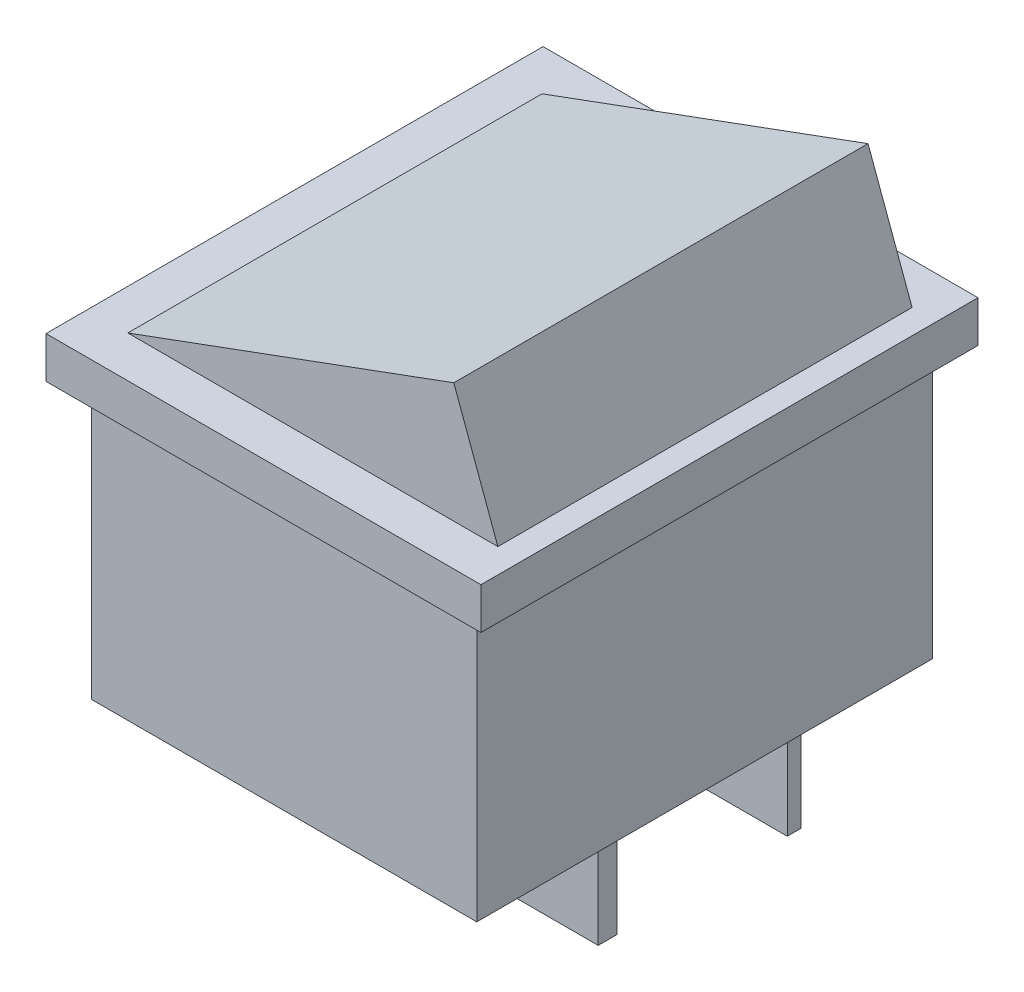
ISO-10303-21;
HEADER;
FILE_DESCRIPTION(('STEP AP214'),'2;1');
FILE_NAME('part.step','',(''),(''),'','','');
FILE_SCHEMA(('AUTOMOTIVE_DESIGN { 1 0 10303 214 1 1 1 1 }'));
ENDSEC;
DATA;
#1=APPLICATION_CONTEXT('core data for automotive mechanical design processes');
#2=APPLICATION_PROTOCOL_DEFINITION('international standard','automotive_design',2000,#1);
#3=PRODUCT_CONTEXT('',#1,'mechanical');
#4=PRODUCT('Part','Part','',(#3));
#5=PRODUCT_RELATED_PRODUCT_CATEGORY('part','',(#4));
#6=PRODUCT_DEFINITION_FORMATION('','',#4);
#7=PRODUCT_DEFINITION_CONTEXT('part definition',#1,'design');
#8=PRODUCT_DEFINITION('design','',#6,#7);
#9=PRODUCT_DEFINITION_SHAPE('','',#8);
#10=(LENGTH_UNIT() NAMED_UNIT(*) SI_UNIT(.MILLI.,.METRE.));
#11=(NAMED_UNIT(*) PLANE_ANGLE_UNIT() SI_UNIT($,.RADIAN.));
#12=(NAMED_UNIT(*) SI_UNIT($,.STERADIAN.) SOLID_ANGLE_UNIT());
#13=UNCERTAINTY_MEASURE_WITH_UNIT(LENGTH_MEASURE(1.E-05),#10,'distance_accuracy_value','');
#14=(GEOMETRIC_REPRESENTATION_CONTEXT(3) GLOBAL_UNCERTAINTY_ASSIGNED_CONTEXT((#13)) GLOBAL_UNIT_ASSIGNED_CONTEXT((#10,
#11,#12)) REPRESENTATION_CONTEXT('',''));
#15=CARTESIAN_POINT('',(0.,0.,0.));
#16=DIRECTION('',(0.,0.,1.));
#17=DIRECTION('',(1.,0.,0.));
#18=AXIS2_PLACEMENT_3D('',#15,#16,#17);
#19=CARTESIAN_POINT('',(0.,-13.2,0.));
#20=DIRECTION('',(0.,1.,0.));
#21=DIRECTION('',(0.,0.,1.));
#22=AXIS2_PLACEMENT_3D('',#19,#20,#21);
#23=PLANE('',#22);
#24=DIRECTION('',(0.,0.,1.));
#25=VECTOR('',#24,1.);
#26=CARTESIAN_POINT('',(-0.986539017006294,-13.2,-6.3761553842312));
#27=LINE('',#26,#25);
#28=CARTESIAN_POINT('',(-0.986539017006294,-13.2,-7.03770330952125));
#29=VERTEX_POINT('',#28);
#30=CARTESIAN_POINT('',(-0.986539017006294,-13.2,-6.3761553842312));
#31=VERTEX_POINT('',#30);
#32=EDGE_CURVE('E265',#29,#31,#27,.T.);
#33=ORIENTED_EDGE('',*,*,#32,.F.);
#34=DIRECTION('',(1.,0.,0.));
#35=VECTOR('',#34,1.);
#36=CARTESIAN_POINT('',(-7.50222735030093,-13.2,-7.03770330952125));
#37=LINE('',#36,#35);
#38=CARTESIAN_POINT('',(-7.50222735030093,-13.2,-7.03770330952125));
#39=VERTEX_POINT('',#38);
#40=EDGE_CURVE('E270',#39,#29,#37,.T.);
#41=ORIENTED_EDGE('',*,*,#40,.F.);
#42=DIRECTION('',(0.,0.,-1.));
#43=VECTOR('',#42,1.);
#44=CARTESIAN_POINT('',(-7.50222735030093,-13.2,-6.3761553842312));
#45=LINE('',#44,#43);
#46=CARTESIAN_POINT('',(-7.50222735030093,-13.2,-6.3761553842312));
#47=VERTEX_POINT('',#46);
#48=EDGE_CURVE('E282',#47,#39,#45,.T.);
#49=ORIENTED_EDGE('',*,*,#48,.F.);
#50=DIRECTION('',(-1.,0.,0.));
#51=VECTOR('',#50,1.);
#52=CARTESIAN_POINT('',(-7.50222735030093,-13.2,-6.3761553842312));
#53=LINE('',#52,#51);
#54=EDGE_CURVE('E279',#31,#47,#53,.T.);
#55=ORIENTED_EDGE('',*,*,#54,.F.);
#56=EDGE_LOOP('',(#33,#41,#49,#55));
#57=FACE_BOUND('',#56,.T.);
#58=DIRECTION('',(0.,0.,-1.));
#59=VECTOR('',#58,1.);
#60=CARTESIAN_POINT('',(2.02938496040161,-13.2,2.75328556763554));
#61=LINE('',#60,#59);
#62=CARTESIAN_POINT('',(2.02938496040161,-13.2,2.75328556763554));
#63=VERTEX_POINT('',#62);
#64=CARTESIAN_POINT('',(2.02938496040161,-13.2,1.85668036748154));
#65=VERTEX_POINT('',#64);
#66=EDGE_CURVE('E331',#63,#65,#61,.T.);
#67=ORIENTED_EDGE('',*,*,#66,.F.);
#68=DIRECTION('',(-1.,0.,0.));
#69=VECTOR('',#68,1.);
#70=CARTESIAN_POINT('',(6.91493386619157,-13.2,2.75328556763554));
#71=LINE('',#70,#69);
#72=CARTESIAN_POINT('',(6.91493386619157,-13.2,2.75328556763554));
#73=VERTEX_POINT('',#72);
#74=EDGE_CURVE('E336',#73,#63,#71,.T.);
#75=ORIENTED_EDGE('',*,*,#74,.F.);
#76=DIRECTION('',(0.,0.,1.));
#77=VECTOR('',#76,1.);
#78=CARTESIAN_POINT('',(6.91493386619157,-13.2,2.75328556763554));
#79=LINE('',#78,#77);
#80=CARTESIAN_POINT('',(6.91493386619157,-13.2,1.85668036748154));
#81=VERTEX_POINT('',#80);
#82=EDGE_CURVE('E348',#81,#73,#79,.T.);
#83=ORIENTED_EDGE('',*,*,#82,.F.);
#84=DIRECTION('',(1.,0.,0.));
#85=VECTOR('',#84,1.);
#86=CARTESIAN_POINT('',(6.91493386619157,-13.2,1.85668036748154));
#87=LINE('',#86,#85);
#88=EDGE_CURVE('E345',#65,#81,#87,.T.);
#89=ORIENTED_EDGE('',*,*,#88,.F.);
#90=EDGE_LOOP('',(#67,#75,#83,#89));
#91=FACE_BOUND('',#90,.T.);
#92=DIRECTION('',(0.,0.,1.));
#93=VECTOR('',#92,1.);
#94=CARTESIAN_POINT('',(9.3,-13.2,-11.));
#95=LINE('',#94,#93);
#96=CARTESIAN_POINT('',(9.3,-13.2,-11.));
#97=VERTEX_POINT('',#96);
#98=CARTESIAN_POINT('',(9.3,-13.2,11.));
#99=VERTEX_POINT('',#98);
#100=EDGE_CURVE('E365',#97,#99,#95,.T.);
#101=ORIENTED_EDGE('',*,*,#100,.T.);
#102=DIRECTION('',(-1.,0.,0.));
#103=VECTOR('',#102,1.);
#104=CARTESIAN_POINT('',(-9.3,-13.2,11.));
#105=LINE('',#104,#103);
#106=CARTESIAN_POINT('',(-9.3,-13.2,11.));
#107=VERTEX_POINT('',#106);
#108=EDGE_CURVE('E368',#99,#107,#105,.T.);
#109=ORIENTED_EDGE('',*,*,#108,.T.);
#110=DIRECTION('',(0.,0.,-1.));
#111=VECTOR('',#110,1.);
#112=CARTESIAN_POINT('',(-9.3,-13.2,-11.));
#113=LINE('',#112,#111);
#114=CARTESIAN_POINT('',(-9.3,-13.2,-11.));
#115=VERTEX_POINT('',#114);
#116=EDGE_CURVE('E371',#107,#115,#113,.T.);
#117=ORIENTED_EDGE('',*,*,#116,.T.);
#118=DIRECTION('',(1.,0.,0.));
#119=VECTOR('',#118,1.);
#120=CARTESIAN_POINT('',(-9.3,-13.2,-11.));
#121=LINE('',#120,#119);
#122=EDGE_CURVE('E373',#115,#97,#121,.T.);
#123=ORIENTED_EDGE('',*,*,#122,.T.);
#124=EDGE_LOOP('',(#101,#109,#117,#123));
#125=FACE_BOUND('',#124,.T.);
#126=DIRECTION('',(0.,0.,1.));
#127=VECTOR('',#126,1.);
#128=CARTESIAN_POINT('',(6.91493386619157,-13.2,-6.3761553842312));
#129=LINE('',#128,#127);
#130=CARTESIAN_POINT('',(6.91493386619157,-13.2,-7.03770330952125));
#131=VERTEX_POINT('',#130);
#132=CARTESIAN_POINT('',(6.91493386619157,-13.2,-6.3761553842312));
#133=VERTEX_POINT('',#132);
#134=EDGE_CURVE('E298',#131,#133,#129,.T.);
#135=ORIENTED_EDGE('',*,*,#134,.F.);
#136=DIRECTION('',(1.,0.,0.));
#137=VECTOR('',#136,1.);
#138=CARTESIAN_POINT('',(2.02938496040161,-13.2,-7.03770330952125));
#139=LINE('',#138,#137);
#140=CARTESIAN_POINT('',(2.02938496040161,-13.2,-7.03770330952125));
#141=VERTEX_POINT('',#140);
#142=EDGE_CURVE('E303',#141,#131,#139,.T.);
#143=ORIENTED_EDGE('',*,*,#142,.F.);
#144=DIRECTION('',(0.,0.,-1.));
#145=VECTOR('',#144,1.);
#146=CARTESIAN_POINT('',(2.02938496040161,-13.2,-6.3761553842312));
#147=LINE('',#146,#145);
#148=CARTESIAN_POINT('',(2.02938496040161,-13.2,-6.3761553842312));
#149=VERTEX_POINT('',#148);
#150=EDGE_CURVE('E315',#149,#141,#147,.T.);
#151=ORIENTED_EDGE('',*,*,#150,.F.);
#152=DIRECTION('',(-1.,0.,0.));
#153=VECTOR('',#152,1.);
#154=CARTESIAN_POINT('',(2.02938496040161,-13.2,-6.3761553842312));
#155=LINE('',#154,#153);
#156=EDGE_CURVE('E312',#133,#149,#155,.T.);
#157=ORIENTED_EDGE('',*,*,#156,.F.);
#158=EDGE_LOOP('',(#135,#143,#151,#157));
#159=FACE_BOUND('',#158,.T.);
#160=DIRECTION('',(0.,0.,1.));
#161=VECTOR('',#160,1.);
#162=CARTESIAN_POINT('',(-0.986539017006294,-13.2,2.75328556763554));
#163=LINE('',#162,#161);
#164=CARTESIAN_POINT('',(-0.986539017006294,-13.2,1.85668036748154));
#165=VERTEX_POINT('',#164);
#166=CARTESIAN_POINT('',(-0.986539017006294,-13.2,2.75328556763554));
#167=VERTEX_POINT('',#166);
#168=EDGE_CURVE('E225',#165,#167,#163,.T.);
#169=ORIENTED_EDGE('',*,*,#168,.F.);
#170=DIRECTION('',(1.,0.,0.));
#171=VECTOR('',#170,1.);
#172=CARTESIAN_POINT('',(-7.50222735030093,-13.2,1.85668036748154));
#173=LINE('',#172,#171);
#174=CARTESIAN_POINT('',(-7.50222735030093,-13.2,1.85668036748154));
#175=VERTEX_POINT('',#174);
#176=EDGE_CURVE('E237',#175,#165,#173,.T.);
#177=ORIENTED_EDGE('',*,*,#176,.F.);
#178=DIRECTION('',(0.,0.,-1.));
#179=VECTOR('',#178,1.);
#180=CARTESIAN_POINT('',(-7.50222735030093,-13.2,2.75328556763554));
#181=LINE('',#180,#179);
#182=CARTESIAN_POINT('',(-7.50222735030093,-13.2,2.75328556763554));
#183=VERTEX_POINT('',#182);
#184=EDGE_CURVE('E249',#183,#175,#181,.T.);
#185=ORIENTED_EDGE('',*,*,#184,.F.);
#186=DIRECTION('',(-1.,0.,0.));
#187=VECTOR('',#186,1.);
#188=CARTESIAN_POINT('',(-7.50222735030093,-13.2,2.75328556763554));
#189=LINE('',#188,#187);
#190=EDGE_CURVE('E246',#167,#183,#189,.T.);
#191=ORIENTED_EDGE('',*,*,#190,.F.);
#192=EDGE_LOOP('',(#169,#177,#185,#191));
#193=FACE_BOUND('',#192,.T.);
#194=ADVANCED_FACE('F35',(#57,#91,#125,#159,#193),#23,.F.);
#195=CARTESIAN_POINT('',(10.5,2.,12.));
#196=DIRECTION('',(-1.,0.,0.));
#197=DIRECTION('',(0.,0.,1.));
#198=AXIS2_PLACEMENT_3D('',#195,#196,#197);
#199=PLANE('',#198);
#200=DIRECTION('',(0.,0.,-1.));
#201=VECTOR('',#200,1.);
#202=CARTESIAN_POINT('',(10.5,0.,12.));
#203=LINE('',#202,#201);
#204=CARTESIAN_POINT('',(10.5,0.,12.));
#205=VERTEX_POINT('',#204);
#206=CARTESIAN_POINT('',(10.5,0.,-12.));
#207=VERTEX_POINT('',#206);
#208=EDGE_CURVE('E397',#205,#207,#203,.T.);
#209=ORIENTED_EDGE('',*,*,#208,.T.);
#210=DIRECTION('',(0.,-1.,0.));
#211=VECTOR('',#210,1.);
#212=CARTESIAN_POINT('',(10.5,2.,-12.));
#213=LINE('',#212,#211);
#214=CARTESIAN_POINT('',(10.5,2.,-12.));
#215=VERTEX_POINT('',#214);
#216=EDGE_CURVE('E424',#215,#207,#213,.T.);
#217=ORIENTED_EDGE('',*,*,#216,.F.);
#218=DIRECTION('',(0.,0.,-1.));
#219=VECTOR('',#218,1.);
#220=CARTESIAN_POINT('',(10.5,2.,12.));
#221=LINE('',#220,#219);
#222=CARTESIAN_POINT('',(10.5,2.,12.));
#223=VERTEX_POINT('',#222);
#224=EDGE_CURVE('E398',#223,#215,#221,.T.);
#225=ORIENTED_EDGE('',*,*,#224,.F.);
#226=DIRECTION('',(0.,-1.,0.));
#227=VECTOR('',#226,1.);
#228=CARTESIAN_POINT('',(10.5,2.,12.));
#229=LINE('',#228,#227);
#230=EDGE_CURVE('E408',#223,#205,#229,.T.);
#231=ORIENTED_EDGE('',*,*,#230,.T.);
#232=EDGE_LOOP('',(#209,#217,#225,#231));
#233=FACE_BOUND('',#232,.T.);
#234=ADVANCED_FACE('F37',(#233),#199,.F.);
#235=CARTESIAN_POINT('',(-10.5,2.,-12.));
#236=DIRECTION('',(0.,0.,1.));
#237=DIRECTION('',(1.,0.,0.));
#238=AXIS2_PLACEMENT_3D('',#235,#236,#237);
#239=PLANE('',#238);
#240=DIRECTION('',(-1.,0.,0.));
#241=VECTOR('',#240,1.);
#242=CARTESIAN_POINT('',(-10.5,0.,-12.));
#243=LINE('',#242,#241);
#244=CARTESIAN_POINT('',(-10.5,0.,-12.));
#245=VERTEX_POINT('',#244);
#246=EDGE_CURVE('E411',#207,#245,#243,.T.);
#247=ORIENTED_EDGE('',*,*,#246,.T.);
#248=DIRECTION('',(0.,-1.,0.));
#249=VECTOR('',#248,1.);
#250=CARTESIAN_POINT('',(-10.5,2.,-12.));
#251=LINE('',#250,#249);
#252=CARTESIAN_POINT('',(-10.5,2.,-12.));
#253=VERTEX_POINT('',#252);
#254=EDGE_CURVE('E421',#253,#245,#251,.T.);
#255=ORIENTED_EDGE('',*,*,#254,.F.);
#256=DIRECTION('',(-1.,0.,0.));
#257=VECTOR('',#256,1.);
#258=CARTESIAN_POINT('',(-10.5,2.,-12.));
#259=LINE('',#258,#257);
#260=EDGE_CURVE('E401',#215,#253,#259,.T.);
#261=ORIENTED_EDGE('',*,*,#260,.F.);
#262=ORIENTED_EDGE('',*,*,#216,.T.);
#263=EDGE_LOOP('',(#247,#255,#261,#262));
#264=FACE_BOUND('',#263,.T.);
#265=ADVANCED_FACE('F446',(#264),#239,.F.);
#266=CARTESIAN_POINT('',(-10.5,2.,12.));
#267=DIRECTION('',(1.,0.,0.));
#268=DIRECTION('',(0.,0.,-1.));
#269=AXIS2_PLACEMENT_3D('',#266,#267,#268);
#270=PLANE('',#269);
#271=DIRECTION('',(0.,0.,1.));
#272=VECTOR('',#271,1.);
#273=CARTESIAN_POINT('',(-10.5,0.,12.));
#274=LINE('',#273,#272);
#275=CARTESIAN_POINT('',(-10.5,0.,12.));
#276=VERTEX_POINT('',#275);
#277=EDGE_CURVE('E413',#245,#276,#274,.T.);
#278=ORIENTED_EDGE('',*,*,#277,.T.);
#279=DIRECTION('',(0.,-1.,0.));
#280=VECTOR('',#279,1.);
#281=CARTESIAN_POINT('',(-10.5,2.,12.));
#282=LINE('',#281,#280);
#283=CARTESIAN_POINT('',(-10.5,2.,12.));
#284=VERTEX_POINT('',#283);
#285=EDGE_CURVE('E418',#284,#276,#282,.T.);
#286=ORIENTED_EDGE('',*,*,#285,.F.);
#287=DIRECTION('',(0.,0.,1.));
#288=VECTOR('',#287,1.);
#289=CARTESIAN_POINT('',(-10.5,2.,12.));
#290=LINE('',#289,#288);
#291=EDGE_CURVE('E404',#253,#284,#290,.T.);
#292=ORIENTED_EDGE('',*,*,#291,.F.);
#293=ORIENTED_EDGE('',*,*,#254,.T.);
#294=EDGE_LOOP('',(#278,#286,#292,#293));
#295=FACE_BOUND('',#294,.T.);
#296=ADVANCED_FACE('F451',(#295),#270,.F.);
#297=CARTESIAN_POINT('',(-10.5,2.,12.));
#298=DIRECTION('',(0.,0.,-1.));
#299=DIRECTION('',(-1.,0.,0.));
#300=AXIS2_PLACEMENT_3D('',#297,#298,#299);
#301=PLANE('',#300);
#302=DIRECTION('',(1.,0.,0.));
#303=VECTOR('',#302,1.);
#304=CARTESIAN_POINT('',(-10.5,0.,12.));
#305=LINE('',#304,#303);
#306=EDGE_CURVE('E402',#276,#205,#305,.T.);
#307=ORIENTED_EDGE('',*,*,#306,.T.);
#308=ORIENTED_EDGE('',*,*,#230,.F.);
#309=DIRECTION('',(1.,0.,0.));
#310=VECTOR('',#309,1.);
#311=CARTESIAN_POINT('',(-10.5,2.,12.));
#312=LINE('',#311,#310);
#313=EDGE_CURVE('E406',#284,#223,#312,.T.);
#314=ORIENTED_EDGE('',*,*,#313,.F.);
#315=ORIENTED_EDGE('',*,*,#285,.T.);
#316=EDGE_LOOP('',(#307,#308,#314,#315));
#317=FACE_BOUND('',#316,.T.);
#318=ADVANCED_FACE('F436',(#317),#301,.F.);
#319=CARTESIAN_POINT('',(0.,2.,0.));
#320=DIRECTION('',(0.,-1.,0.));
#321=DIRECTION('',(0.,0.,-1.));
#322=AXIS2_PLACEMENT_3D('',#319,#320,#321);
#323=PLANE('',#322);
#324=DIRECTION('',(0.,0.,-1.));
#325=VECTOR('',#324,1.);
#326=CARTESIAN_POINT('',(9.31740590935352,2.,0.));
#327=LINE('',#326,#325);
#328=CARTESIAN_POINT('',(9.31740590935352,2.,10.));
#329=VERTEX_POINT('',#328);
#330=CARTESIAN_POINT('',(9.31740590935353,2.,-10.));
#331=VERTEX_POINT('',#330);
#332=EDGE_CURVE('E43',#329,#331,#327,.T.);
#333=ORIENTED_EDGE('',*,*,#332,.F.);
#334=DIRECTION('',(-1.,0.,0.));
#335=VECTOR('',#334,1.);
#336=CARTESIAN_POINT('',(0.,2.,10.));
#337=LINE('',#336,#335);
#338=CARTESIAN_POINT('',(-8.55063590161822,2.,10.));
#339=VERTEX_POINT('',#338);
#340=EDGE_CURVE('E11',#329,#339,#337,.T.);
#341=ORIENTED_EDGE('',*,*,#340,.T.);
#342=DIRECTION('',(0.,0.,1.));
#343=VECTOR('',#342,1.);
#344=CARTESIAN_POINT('',(-8.55063590161822,2.,0.));
#345=LINE('',#344,#343);
#346=CARTESIAN_POINT('',(-8.55063590161822,2.,-10.));
#347=VERTEX_POINT('',#346);
#348=EDGE_CURVE('E228',#347,#339,#345,.T.);
#349=ORIENTED_EDGE('',*,*,#348,.F.);
#350=DIRECTION('',(-1.,0.,0.));
#351=VECTOR('',#350,1.);
#352=CARTESIAN_POINT('',(0.,2.,-10.));
#353=LINE('',#352,#351);
#354=EDGE_CURVE('E427',#331,#347,#353,.T.);
#355=ORIENTED_EDGE('',*,*,#354,.F.);
#356=EDGE_LOOP('',(#333,#341,#349,#355));
#357=FACE_BOUND('',#356,.T.);
#358=ORIENTED_EDGE('',*,*,#224,.T.);
#359=ORIENTED_EDGE('',*,*,#260,.T.);
#360=ORIENTED_EDGE('',*,*,#291,.T.);
#361=ORIENTED_EDGE('',*,*,#313,.T.);
#362=EDGE_LOOP('',(#358,#359,#360,#361));
#363=FACE_BOUND('',#362,.T.);
#364=ADVANCED_FACE('F432',(#357,#363),#323,.F.);
#365=CARTESIAN_POINT('',(0.,0.,0.));
#366=DIRECTION('',(0.,-1.,0.));
#367=DIRECTION('',(0.,0.,-1.));
#368=AXIS2_PLACEMENT_3D('',#365,#366,#367);
#369=PLANE('',#368);
#370=DIRECTION('',(0.,0.,1.));
#371=VECTOR('',#370,1.);
#372=CARTESIAN_POINT('',(9.3,0.,-11.));
#373=LINE('',#372,#371);
#374=CARTESIAN_POINT('',(9.3,0.,-11.));
#375=VERTEX_POINT('',#374);
#376=CARTESIAN_POINT('',(9.3,0.,11.));
#377=VERTEX_POINT('',#376);
#378=EDGE_CURVE('E364',#375,#377,#373,.T.);
#379=ORIENTED_EDGE('',*,*,#378,.F.);
#380=DIRECTION('',(1.,0.,0.));
#381=VECTOR('',#380,1.);
#382=CARTESIAN_POINT('',(-9.3,0.,-11.));
#383=LINE('',#382,#381);
#384=CARTESIAN_POINT('',(-9.3,0.,-11.));
#385=VERTEX_POINT('',#384);
#386=EDGE_CURVE('E369',#385,#375,#383,.T.);
#387=ORIENTED_EDGE('',*,*,#386,.F.);
#388=DIRECTION('',(0.,0.,-1.));
#389=VECTOR('',#388,1.);
#390=CARTESIAN_POINT('',(-9.3,0.,-11.));
#391=LINE('',#390,#389);
#392=CARTESIAN_POINT('',(-9.3,0.,11.));
#393=VERTEX_POINT('',#392);
#394=EDGE_CURVE('E381',#393,#385,#391,.T.);
#395=ORIENTED_EDGE('',*,*,#394,.F.);
#396=DIRECTION('',(-1.,0.,0.));
#397=VECTOR('',#396,1.);
#398=CARTESIAN_POINT('',(-9.3,0.,11.));
#399=LINE('',#398,#397);
#400=EDGE_CURVE('E378',#377,#393,#399,.T.);
#401=ORIENTED_EDGE('',*,*,#400,.F.);
#402=EDGE_LOOP('',(#379,#387,#395,#401));
#403=FACE_BOUND('',#402,.T.);
#404=ORIENTED_EDGE('',*,*,#208,.F.);
#405=ORIENTED_EDGE('',*,*,#306,.F.);
#406=ORIENTED_EDGE('',*,*,#277,.F.);
#407=ORIENTED_EDGE('',*,*,#246,.F.);
#408=EDGE_LOOP('',(#404,#405,#406,#407));
#409=FACE_BOUND('',#408,.T.);
#410=ADVANCED_FACE('F435',(#403,#409),#369,.T.);
#411=CARTESIAN_POINT('',(9.3,-13.2,-11.));
#412=DIRECTION('',(-1.,0.,0.));
#413=DIRECTION('',(0.,0.,1.));
#414=AXIS2_PLACEMENT_3D('',#411,#412,#413);
#415=PLANE('',#414);
#416=ORIENTED_EDGE('',*,*,#378,.T.);
#417=DIRECTION('',(0.,1.,0.));
#418=VECTOR('',#417,1.);
#419=CARTESIAN_POINT('',(9.3,-13.2,11.));
#420=LINE('',#419,#418);
#421=EDGE_CURVE('E394',#99,#377,#420,.T.);
#422=ORIENTED_EDGE('',*,*,#421,.F.);
#423=ORIENTED_EDGE('',*,*,#100,.F.);
#424=DIRECTION('',(0.,1.,0.));
#425=VECTOR('',#424,1.);
#426=CARTESIAN_POINT('',(9.3,-13.2,-11.));
#427=LINE('',#426,#425);
#428=EDGE_CURVE('E375',#97,#375,#427,.T.);
#429=ORIENTED_EDGE('',*,*,#428,.T.);
#430=EDGE_LOOP('',(#416,#422,#423,#429));
#431=FACE_BOUND('',#430,.T.);
#432=ADVANCED_FACE('F456',(#431),#415,.F.);
#433=CARTESIAN_POINT('',(-9.3,-13.2,11.));
#434=DIRECTION('',(0.,0.,-1.));
#435=DIRECTION('',(-1.,0.,0.));
#436=AXIS2_PLACEMENT_3D('',#433,#434,#435);
#437=PLANE('',#436);
#438=ORIENTED_EDGE('',*,*,#400,.T.);
#439=DIRECTION('',(0.,1.,0.));
#440=VECTOR('',#439,1.);
#441=CARTESIAN_POINT('',(-9.3,-13.2,11.));
#442=LINE('',#441,#440);
#443=EDGE_CURVE('E391',#107,#393,#442,.T.);
#444=ORIENTED_EDGE('',*,*,#443,.F.);
#445=ORIENTED_EDGE('',*,*,#108,.F.);
#446=ORIENTED_EDGE('',*,*,#421,.T.);
#447=EDGE_LOOP('',(#438,#444,#445,#446));
#448=FACE_BOUND('',#447,.T.);
#449=ADVANCED_FACE('F462',(#448),#437,.F.);
#450=CARTESIAN_POINT('',(-9.3,-13.2,-11.));
#451=DIRECTION('',(1.,0.,0.));
#452=DIRECTION('',(0.,0.,-1.));
#453=AXIS2_PLACEMENT_3D('',#450,#451,#452);
#454=PLANE('',#453);
#455=ORIENTED_EDGE('',*,*,#394,.T.);
#456=DIRECTION('',(0.,1.,0.));
#457=VECTOR('',#456,1.);
#458=CARTESIAN_POINT('',(-9.3,-13.2,-11.));
#459=LINE('',#458,#457);
#460=EDGE_CURVE('E388',#115,#385,#459,.T.);
#461=ORIENTED_EDGE('',*,*,#460,.F.);
#462=ORIENTED_EDGE('',*,*,#116,.F.);
#463=ORIENTED_EDGE('',*,*,#443,.T.);
#464=EDGE_LOOP('',(#455,#461,#462,#463));
#465=FACE_BOUND('',#464,.T.);
#466=ADVANCED_FACE('F480',(#465),#454,.F.);
#467=CARTESIAN_POINT('',(-9.3,-13.2,-11.));
#468=DIRECTION('',(0.,0.,1.));
#469=DIRECTION('',(1.,0.,0.));
#470=AXIS2_PLACEMENT_3D('',#467,#468,#469);
#471=PLANE('',#470);
#472=ORIENTED_EDGE('',*,*,#386,.T.);
#473=ORIENTED_EDGE('',*,*,#428,.F.);
#474=ORIENTED_EDGE('',*,*,#122,.F.);
#475=ORIENTED_EDGE('',*,*,#460,.T.);
#476=EDGE_LOOP('',(#472,#473,#474,#475));
#477=FACE_BOUND('',#476,.T.);
#478=ADVANCED_FACE('F477',(#477),#471,.F.);
#479=CARTESIAN_POINT('',(2.02938496040161,-19.5,2.75328556763554));
#480=DIRECTION('',(1.,0.,0.));
#481=DIRECTION('',(0.,0.,-1.));
#482=AXIS2_PLACEMENT_3D('',#479,#480,#481);
#483=PLANE('',#482);
#484=ORIENTED_EDGE('',*,*,#66,.T.);
#485=DIRECTION('',(0.,1.,0.));
#486=VECTOR('',#485,1.);
#487=CARTESIAN_POINT('',(2.02938496040161,-19.5,1.85668036748154));
#488=LINE('',#487,#486);
#489=CARTESIAN_POINT('',(2.02938496040161,-19.5,1.85668036748154));
#490=VERTEX_POINT('',#489);
#491=EDGE_CURVE('E361',#490,#65,#488,.T.);
#492=ORIENTED_EDGE('',*,*,#491,.F.);
#493=DIRECTION('',(0.,0.,-1.));
#494=VECTOR('',#493,1.);
#495=CARTESIAN_POINT('',(2.02938496040161,-19.5,2.75328556763554));
#496=LINE('',#495,#494);
#497=CARTESIAN_POINT('',(2.02938496040161,-19.5,2.75328556763554));
#498=VERTEX_POINT('',#497);
#499=EDGE_CURVE('E332',#498,#490,#496,.T.);
#500=ORIENTED_EDGE('',*,*,#499,.F.);
#501=DIRECTION('',(0.,1.,0.));
#502=VECTOR('',#501,1.);
#503=CARTESIAN_POINT('',(2.02938496040161,-19.5,2.75328556763554));
#504=LINE('',#503,#502);
#505=EDGE_CURVE('E342',#498,#63,#504,.T.);
#506=ORIENTED_EDGE('',*,*,#505,.T.);
#507=EDGE_LOOP('',(#484,#492,#500,#506));
#508=FACE_BOUND('',#507,.T.);
#509=ADVANCED_FACE('F475',(#508),#483,.F.);
#510=CARTESIAN_POINT('',(6.91493386619157,-19.5,1.85668036748154));
#511=DIRECTION('',(0.,0.,1.));
#512=DIRECTION('',(1.,0.,0.));
#513=AXIS2_PLACEMENT_3D('',#510,#511,#512);
#514=PLANE('',#513);
#515=ORIENTED_EDGE('',*,*,#88,.T.);
#516=DIRECTION('',(0.,1.,0.));
#517=VECTOR('',#516,1.);
#518=CARTESIAN_POINT('',(6.91493386619157,-19.5,1.85668036748154));
#519=LINE('',#518,#517);
#520=CARTESIAN_POINT('',(6.91493386619157,-19.5,1.85668036748154));
#521=VERTEX_POINT('',#520);
#522=EDGE_CURVE('E358',#521,#81,#519,.T.);
#523=ORIENTED_EDGE('',*,*,#522,.F.);
#524=DIRECTION('',(1.,0.,0.));
#525=VECTOR('',#524,1.);
#526=CARTESIAN_POINT('',(6.91493386619157,-19.5,1.85668036748154));
#527=LINE('',#526,#525);
#528=EDGE_CURVE('E335',#490,#521,#527,.T.);
#529=ORIENTED_EDGE('',*,*,#528,.F.);
#530=ORIENTED_EDGE('',*,*,#491,.T.);
#531=EDGE_LOOP('',(#515,#523,#529,#530));
#532=FACE_BOUND('',#531,.T.);
#533=ADVANCED_FACE('F576',(#532),#514,.F.);
#534=CARTESIAN_POINT('',(6.91493386619157,-19.5,2.75328556763554));
#535=DIRECTION('',(-1.,0.,0.));
#536=DIRECTION('',(0.,0.,1.));
#537=AXIS2_PLACEMENT_3D('',#534,#535,#536);
#538=PLANE('',#537);
#539=ORIENTED_EDGE('',*,*,#82,.T.);
#540=DIRECTION('',(0.,1.,0.));
#541=VECTOR('',#540,1.);
#542=CARTESIAN_POINT('',(6.91493386619157,-19.5,2.75328556763554));
#543=LINE('',#542,#541);
#544=CARTESIAN_POINT('',(6.91493386619157,-19.5,2.75328556763554));
#545=VERTEX_POINT('',#544);
#546=EDGE_CURVE('E355',#545,#73,#543,.T.);
#547=ORIENTED_EDGE('',*,*,#546,.F.);
#548=DIRECTION('',(0.,0.,1.));
#549=VECTOR('',#548,1.);
#550=CARTESIAN_POINT('',(6.91493386619157,-19.5,2.75328556763554));
#551=LINE('',#550,#549);
#552=EDGE_CURVE('E338',#521,#545,#551,.T.);
#553=ORIENTED_EDGE('',*,*,#552,.F.);
#554=ORIENTED_EDGE('',*,*,#522,.T.);
#555=EDGE_LOOP('',(#539,#547,#553,#554));
#556=FACE_BOUND('',#555,.T.);
#557=ADVANCED_FACE('F573',(#556),#538,.F.);
#558=CARTESIAN_POINT('',(6.91493386619157,-19.5,2.75328556763554));
#559=DIRECTION('',(0.,0.,-1.));
#560=DIRECTION('',(-1.,0.,0.));
#561=AXIS2_PLACEMENT_3D('',#558,#559,#560);
#562=PLANE('',#561);
#563=ORIENTED_EDGE('',*,*,#74,.T.);
#564=ORIENTED_EDGE('',*,*,#505,.F.);
#565=DIRECTION('',(-1.,0.,0.));
#566=VECTOR('',#565,1.);
#567=CARTESIAN_POINT('',(6.91493386619157,-19.5,2.75328556763554));
#568=LINE('',#567,#566);
#569=EDGE_CURVE('E340',#545,#498,#568,.T.);
#570=ORIENTED_EDGE('',*,*,#569,.F.);
#571=ORIENTED_EDGE('',*,*,#546,.T.);
#572=EDGE_LOOP('',(#563,#564,#570,#571));
#573=FACE_BOUND('',#572,.T.);
#574=ADVANCED_FACE('F569',(#573),#562,.F.);
#575=CARTESIAN_POINT('',(0.,-19.5,0.));
#576=DIRECTION('',(0.,1.,0.));
#577=DIRECTION('',(0.,0.,1.));
#578=AXIS2_PLACEMENT_3D('',#575,#576,#577);
#579=PLANE('',#578);
#580=ORIENTED_EDGE('',*,*,#499,.T.);
#581=ORIENTED_EDGE('',*,*,#528,.T.);
#582=ORIENTED_EDGE('',*,*,#552,.T.);
#583=ORIENTED_EDGE('',*,*,#569,.T.);
#584=EDGE_LOOP('',(#580,#581,#582,#583));
#585=FACE_BOUND('',#584,.T.);
#586=ADVANCED_FACE('F565',(#585),#579,.F.);
#587=CARTESIAN_POINT('',(6.91493386619157,-19.5,-6.3761553842312));
#588=DIRECTION('',(-1.,0.,0.));
#589=DIRECTION('',(0.,0.,1.));
#590=AXIS2_PLACEMENT_3D('',#587,#588,#589);
#591=PLANE('',#590);
#592=ORIENTED_EDGE('',*,*,#134,.T.);
#593=DIRECTION('',(0.,1.,0.));
#594=VECTOR('',#593,1.);
#595=CARTESIAN_POINT('',(6.91493386619157,-19.5,-6.3761553842312));
#596=LINE('',#595,#594);
#597=CARTESIAN_POINT('',(6.91493386619157,-19.5,-6.3761553842312));
#598=VERTEX_POINT('',#597);
#599=EDGE_CURVE('E328',#598,#133,#596,.T.);
#600=ORIENTED_EDGE('',*,*,#599,.F.);
#601=DIRECTION('',(0.,0.,1.));
#602=VECTOR('',#601,1.);
#603=CARTESIAN_POINT('',(6.91493386619157,-19.5,-6.3761553842312));
#604=LINE('',#603,#602);
#605=CARTESIAN_POINT('',(6.91493386619157,-19.5,-7.03770330952125));
#606=VERTEX_POINT('',#605);
#607=EDGE_CURVE('E299',#606,#598,#604,.T.);
#608=ORIENTED_EDGE('',*,*,#607,.F.);
#609=DIRECTION('',(0.,1.,0.));
#610=VECTOR('',#609,1.);
#611=CARTESIAN_POINT('',(6.91493386619157,-19.5,-7.03770330952125));
#612=LINE('',#611,#610);
#613=EDGE_CURVE('E309',#606,#131,#612,.T.);
#614=ORIENTED_EDGE('',*,*,#613,.T.);
#615=EDGE_LOOP('',(#592,#600,#608,#614));
#616=FACE_BOUND('',#615,.T.);
#617=ADVANCED_FACE('F561',(#616),#591,.F.);
#618=CARTESIAN_POINT('',(2.02938496040161,-19.5,-6.3761553842312));
#619=DIRECTION('',(0.,0.,-1.));
#620=DIRECTION('',(-1.,0.,0.));
#621=AXIS2_PLACEMENT_3D('',#618,#619,#620);
#622=PLANE('',#621);
#623=ORIENTED_EDGE('',*,*,#156,.T.);
#624=DIRECTION('',(0.,1.,0.));
#625=VECTOR('',#624,1.);
#626=CARTESIAN_POINT('',(2.02938496040161,-19.5,-6.3761553842312));
#627=LINE('',#626,#625);
#628=CARTESIAN_POINT('',(2.02938496040161,-19.5,-6.3761553842312));
#629=VERTEX_POINT('',#628);
#630=EDGE_CURVE('E325',#629,#149,#627,.T.);
#631=ORIENTED_EDGE('',*,*,#630,.F.);
#632=DIRECTION('',(-1.,0.,0.));
#633=VECTOR('',#632,1.);
#634=CARTESIAN_POINT('',(2.02938496040161,-19.5,-6.3761553842312));
#635=LINE('',#634,#633);
#636=EDGE_CURVE('E302',#598,#629,#635,.T.);
#637=ORIENTED_EDGE('',*,*,#636,.F.);
#638=ORIENTED_EDGE('',*,*,#599,.T.);
#639=EDGE_LOOP('',(#623,#631,#637,#638));
#640=FACE_BOUND('',#639,.T.);
#641=ADVANCED_FACE('F557',(#640),#622,.F.);
#642=CARTESIAN_POINT('',(2.02938496040161,-19.5,-6.3761553842312));
#643=DIRECTION('',(1.,0.,0.));
#644=DIRECTION('',(0.,0.,-1.));
#645=AXIS2_PLACEMENT_3D('',#642,#643,#644);
#646=PLANE('',#645);
#647=ORIENTED_EDGE('',*,*,#150,.T.);
#648=DIRECTION('',(0.,1.,0.));
#649=VECTOR('',#648,1.);
#650=CARTESIAN_POINT('',(2.02938496040161,-19.5,-7.03770330952125));
#651=LINE('',#650,#649);
#652=CARTESIAN_POINT('',(2.02938496040161,-19.5,-7.03770330952125));
#653=VERTEX_POINT('',#652);
#654=EDGE_CURVE('E322',#653,#141,#651,.T.);
#655=ORIENTED_EDGE('',*,*,#654,.F.);
#656=DIRECTION('',(0.,0.,-1.));
#657=VECTOR('',#656,1.);
#658=CARTESIAN_POINT('',(2.02938496040161,-19.5,-6.3761553842312));
#659=LINE('',#658,#657);
#660=EDGE_CURVE('E305',#629,#653,#659,.T.);
#661=ORIENTED_EDGE('',*,*,#660,.F.);
#662=ORIENTED_EDGE('',*,*,#630,.T.);
#663=EDGE_LOOP('',(#647,#655,#661,#662));
#664=FACE_BOUND('',#663,.T.);
#665=ADVANCED_FACE('F553',(#664),#646,.F.);
#666=CARTESIAN_POINT('',(2.02938496040161,-19.5,-7.03770330952125));
#667=DIRECTION('',(0.,0.,1.));
#668=DIRECTION('',(1.,0.,0.));
#669=AXIS2_PLACEMENT_3D('',#666,#667,#668);
#670=PLANE('',#669);
#671=ORIENTED_EDGE('',*,*,#142,.T.);
#672=ORIENTED_EDGE('',*,*,#613,.F.);
#673=DIRECTION('',(1.,0.,0.));
#674=VECTOR('',#673,1.);
#675=CARTESIAN_POINT('',(2.02938496040161,-19.5,-7.03770330952125));
#676=LINE('',#675,#674);
#677=EDGE_CURVE('E307',#653,#606,#676,.T.);
#678=ORIENTED_EDGE('',*,*,#677,.F.);
#679=ORIENTED_EDGE('',*,*,#654,.T.);
#680=EDGE_LOOP('',(#671,#672,#678,#679));
#681=FACE_BOUND('',#680,.T.);
#682=ADVANCED_FACE('F549',(#681),#670,.F.);
#683=CARTESIAN_POINT('',(0.,-19.5,0.));
#684=DIRECTION('',(0.,-1.,0.));
#685=DIRECTION('',(0.,0.,-1.));
#686=AXIS2_PLACEMENT_3D('',#683,#684,#685);
#687=PLANE('',#686);
#688=ORIENTED_EDGE('',*,*,#607,.T.);
#689=ORIENTED_EDGE('',*,*,#636,.T.);
#690=ORIENTED_EDGE('',*,*,#660,.T.);
#691=ORIENTED_EDGE('',*,*,#677,.T.);
#692=EDGE_LOOP('',(#688,#689,#690,#691));
#693=FACE_BOUND('',#692,.T.);
#694=ADVANCED_FACE('F545',(#693),#687,.T.);
#695=CARTESIAN_POINT('',(-0.986539017006294,-19.5,-6.3761553842312));
#696=DIRECTION('',(-1.,0.,0.));
#697=DIRECTION('',(0.,0.,1.));
#698=AXIS2_PLACEMENT_3D('',#695,#696,#697);
#699=PLANE('',#698);
#700=ORIENTED_EDGE('',*,*,#32,.T.);
#701=DIRECTION('',(0.,1.,0.));
#702=VECTOR('',#701,1.);
#703=CARTESIAN_POINT('',(-0.986539017006294,-19.5,-6.3761553842312));
#704=LINE('',#703,#702);
#705=CARTESIAN_POINT('',(-0.986539017006294,-19.5,-6.3761553842312));
#706=VERTEX_POINT('',#705);
#707=EDGE_CURVE('E295',#706,#31,#704,.T.);
#708=ORIENTED_EDGE('',*,*,#707,.F.);
#709=DIRECTION('',(0.,0.,1.));
#710=VECTOR('',#709,1.);
#711=CARTESIAN_POINT('',(-0.986539017006294,-19.5,-6.3761553842312));
#712=LINE('',#711,#710);
#713=CARTESIAN_POINT('',(-0.986539017006294,-19.5,-7.03770330952125));
#714=VERTEX_POINT('',#713);
#715=EDGE_CURVE('E266',#714,#706,#712,.T.);
#716=ORIENTED_EDGE('',*,*,#715,.F.);
#717=DIRECTION('',(0.,1.,0.));
#718=VECTOR('',#717,1.);
#719=CARTESIAN_POINT('',(-0.986539017006294,-19.5,-7.03770330952125));
#720=LINE('',#719,#718);
#721=EDGE_CURVE('E276',#714,#29,#720,.T.);
#722=ORIENTED_EDGE('',*,*,#721,.T.);
#723=EDGE_LOOP('',(#700,#708,#716,#722));
#724=FACE_BOUND('',#723,.T.);
#725=ADVANCED_FACE('F541',(#724),#699,.F.);
#726=CARTESIAN_POINT('',(-7.50222735030093,-19.5,-6.3761553842312));
#727=DIRECTION('',(0.,0.,-1.));
#728=DIRECTION('',(-1.,0.,0.));
#729=AXIS2_PLACEMENT_3D('',#726,#727,#728);
#730=PLANE('',#729);
#731=ORIENTED_EDGE('',*,*,#54,.T.);
#732=DIRECTION('',(0.,1.,0.));
#733=VECTOR('',#732,1.);
#734=CARTESIAN_POINT('',(-7.50222735030093,-19.5,-6.3761553842312));
#735=LINE('',#734,#733);
#736=CARTESIAN_POINT('',(-7.50222735030093,-19.5,-6.3761553842312));
#737=VERTEX_POINT('',#736);
#738=EDGE_CURVE('E292',#737,#47,#735,.T.);
#739=ORIENTED_EDGE('',*,*,#738,.F.);
#740=DIRECTION('',(-1.,0.,0.));
#741=VECTOR('',#740,1.);
#742=CARTESIAN_POINT('',(-7.50222735030093,-19.5,-6.3761553842312));
#743=LINE('',#742,#741);
#744=EDGE_CURVE('E269',#706,#737,#743,.T.);
#745=ORIENTED_EDGE('',*,*,#744,.F.);
#746=ORIENTED_EDGE('',*,*,#707,.T.);
#747=EDGE_LOOP('',(#731,#739,#745,#746));
#748=FACE_BOUND('',#747,.T.);
#749=ADVANCED_FACE('F537',(#748),#730,.F.);
#750=CARTESIAN_POINT('',(-7.50222735030093,-19.5,-6.3761553842312));
#751=DIRECTION('',(1.,0.,0.));
#752=DIRECTION('',(0.,0.,-1.));
#753=AXIS2_PLACEMENT_3D('',#750,#751,#752);
#754=PLANE('',#753);
#755=ORIENTED_EDGE('',*,*,#48,.T.);
#756=DIRECTION('',(0.,1.,0.));
#757=VECTOR('',#756,1.);
#758=CARTESIAN_POINT('',(-7.50222735030093,-19.5,-7.03770330952125));
#759=LINE('',#758,#757);
#760=CARTESIAN_POINT('',(-7.50222735030093,-19.5,-7.03770330952125));
#761=VERTEX_POINT('',#760);
#762=EDGE_CURVE('E289',#761,#39,#759,.T.);
#763=ORIENTED_EDGE('',*,*,#762,.F.);
#764=DIRECTION('',(0.,0.,-1.));
#765=VECTOR('',#764,1.);
#766=CARTESIAN_POINT('',(-7.50222735030093,-19.5,-6.3761553842312));
#767=LINE('',#766,#765);
#768=EDGE_CURVE('E272',#737,#761,#767,.T.);
#769=ORIENTED_EDGE('',*,*,#768,.F.);
#770=ORIENTED_EDGE('',*,*,#738,.T.);
#771=EDGE_LOOP('',(#755,#763,#769,#770));
#772=FACE_BOUND('',#771,.T.);
#773=ADVANCED_FACE('F533',(#772),#754,.F.);
#774=CARTESIAN_POINT('',(-7.50222735030093,-19.5,-7.03770330952125));
#775=DIRECTION('',(0.,0.,1.));
#776=DIRECTION('',(1.,0.,0.));
#777=AXIS2_PLACEMENT_3D('',#774,#775,#776);
#778=PLANE('',#777);
#779=ORIENTED_EDGE('',*,*,#40,.T.);
#780=ORIENTED_EDGE('',*,*,#721,.F.);
#781=DIRECTION('',(1.,0.,0.));
#782=VECTOR('',#781,1.);
#783=CARTESIAN_POINT('',(-7.50222735030093,-19.5,-7.03770330952125));
#784=LINE('',#783,#782);
#785=EDGE_CURVE('E274',#761,#714,#784,.T.);
#786=ORIENTED_EDGE('',*,*,#785,.F.);
#787=ORIENTED_EDGE('',*,*,#762,.T.);
#788=EDGE_LOOP('',(#779,#780,#786,#787));
#789=FACE_BOUND('',#788,.T.);
#790=ADVANCED_FACE('F529',(#789),#778,.F.);
#791=CARTESIAN_POINT('',(0.,-19.5,0.));
#792=DIRECTION('',(0.,-1.,0.));
#793=DIRECTION('',(0.,0.,-1.));
#794=AXIS2_PLACEMENT_3D('',#791,#792,#793);
#795=PLANE('',#794);
#796=ORIENTED_EDGE('',*,*,#715,.T.);
#797=ORIENTED_EDGE('',*,*,#744,.T.);
#798=ORIENTED_EDGE('',*,*,#768,.T.);
#799=ORIENTED_EDGE('',*,*,#785,.T.);
#800=EDGE_LOOP('',(#796,#797,#798,#799));
#801=FACE_BOUND('',#800,.T.);
#802=ADVANCED_FACE('F523',(#801),#795,.T.);
#803=CARTESIAN_POINT('',(-0.986539017006294,-19.5,2.75328556763554));
#804=DIRECTION('',(-1.,0.,0.));
#805=DIRECTION('',(0.,0.,1.));
#806=AXIS2_PLACEMENT_3D('',#803,#804,#805);
#807=PLANE('',#806);
#808=ORIENTED_EDGE('',*,*,#168,.T.);
#809=DIRECTION('',(0.,1.,0.));
#810=VECTOR('',#809,1.);
#811=CARTESIAN_POINT('',(-0.986539017006294,-19.5,2.75328556763554));
#812=LINE('',#811,#810);
#813=CARTESIAN_POINT('',(-0.986539017006294,-19.5,2.75328556763554));
#814=VERTEX_POINT('',#813);
#815=EDGE_CURVE('E262',#814,#167,#812,.T.);
#816=ORIENTED_EDGE('',*,*,#815,.F.);
#817=DIRECTION('',(0.,0.,1.));
#818=VECTOR('',#817,1.);
#819=CARTESIAN_POINT('',(-0.986539017006294,-19.5,2.75328556763554));
#820=LINE('',#819,#818);
#821=CARTESIAN_POINT('',(-0.986539017006294,-19.5,1.85668036748154));
#822=VERTEX_POINT('',#821);
#823=EDGE_CURVE('E233',#822,#814,#820,.T.);
#824=ORIENTED_EDGE('',*,*,#823,.F.);
#825=DIRECTION('',(0.,1.,0.));
#826=VECTOR('',#825,1.);
#827=CARTESIAN_POINT('',(-0.986539017006294,-19.5,1.85668036748154));
#828=LINE('',#827,#826);
#829=EDGE_CURVE('E243',#822,#165,#828,.T.);
#830=ORIENTED_EDGE('',*,*,#829,.T.);
#831=EDGE_LOOP('',(#808,#816,#824,#830));
#832=FACE_BOUND('',#831,.T.);
#833=ADVANCED_FACE('F507',(#832),#807,.F.);
#834=CARTESIAN_POINT('',(-7.50222735030093,-19.5,2.75328556763554));
#835=DIRECTION('',(0.,0.,-1.));
#836=DIRECTION('',(-1.,0.,0.));
#837=AXIS2_PLACEMENT_3D('',#834,#835,#836);
#838=PLANE('',#837);
#839=ORIENTED_EDGE('',*,*,#190,.T.);
#840=DIRECTION('',(0.,1.,0.));
#841=VECTOR('',#840,1.);
#842=CARTESIAN_POINT('',(-7.50222735030093,-19.5,2.75328556763554));
#843=LINE('',#842,#841);
#844=CARTESIAN_POINT('',(-7.50222735030093,-19.5,2.75328556763554));
#845=VERTEX_POINT('',#844);
#846=EDGE_CURVE('E259',#845,#183,#843,.T.);
#847=ORIENTED_EDGE('',*,*,#846,.F.);
#848=DIRECTION('',(-1.,0.,0.));
#849=VECTOR('',#848,1.);
#850=CARTESIAN_POINT('',(-7.50222735030093,-19.5,2.75328556763554));
#851=LINE('',#850,#849);
#852=EDGE_CURVE('E236',#814,#845,#851,.T.);
#853=ORIENTED_EDGE('',*,*,#852,.F.);
#854=ORIENTED_EDGE('',*,*,#815,.T.);
#855=EDGE_LOOP('',(#839,#847,#853,#854));
#856=FACE_BOUND('',#855,.T.);
#857=ADVANCED_FACE('F515',(#856),#838,.F.);
#858=CARTESIAN_POINT('',(-7.50222735030093,-19.5,2.75328556763554));
#859=DIRECTION('',(1.,0.,0.));
#860=DIRECTION('',(0.,0.,-1.));
#861=AXIS2_PLACEMENT_3D('',#858,#859,#860);
#862=PLANE('',#861);
#863=ORIENTED_EDGE('',*,*,#184,.T.);
#864=DIRECTION('',(0.,1.,0.));
#865=VECTOR('',#864,1.);
#866=CARTESIAN_POINT('',(-7.50222735030093,-19.5,1.85668036748154));
#867=LINE('',#866,#865);
#868=CARTESIAN_POINT('',(-7.50222735030093,-19.5,1.85668036748154));
#869=VERTEX_POINT('',#868);
#870=EDGE_CURVE('E256',#869,#175,#867,.T.);
#871=ORIENTED_EDGE('',*,*,#870,.F.);
#872=DIRECTION('',(0.,0.,-1.));
#873=VECTOR('',#872,1.);
#874=CARTESIAN_POINT('',(-7.50222735030093,-19.5,2.75328556763554));
#875=LINE('',#874,#873);
#876=EDGE_CURVE('E239',#845,#869,#875,.T.);
#877=ORIENTED_EDGE('',*,*,#876,.F.);
#878=ORIENTED_EDGE('',*,*,#846,.T.);
#879=EDGE_LOOP('',(#863,#871,#877,#878));
#880=FACE_BOUND('',#879,.T.);
#881=ADVANCED_FACE('F513',(#880),#862,.F.);
#882=CARTESIAN_POINT('',(-7.50222735030093,-19.5,1.85668036748154));
#883=DIRECTION('',(0.,0.,1.));
#884=DIRECTION('',(1.,0.,0.));
#885=AXIS2_PLACEMENT_3D('',#882,#883,#884);
#886=PLANE('',#885);
#887=ORIENTED_EDGE('',*,*,#176,.T.);
#888=ORIENTED_EDGE('',*,*,#829,.F.);
#889=DIRECTION('',(1.,0.,0.));
#890=VECTOR('',#889,1.);
#891=CARTESIAN_POINT('',(-7.50222735030093,-19.5,1.85668036748154));
#892=LINE('',#891,#890);
#893=EDGE_CURVE('E241',#869,#822,#892,.T.);
#894=ORIENTED_EDGE('',*,*,#893,.F.);
#895=ORIENTED_EDGE('',*,*,#870,.T.);
#896=EDGE_LOOP('',(#887,#888,#894,#895));
#897=FACE_BOUND('',#896,.T.);
#898=ADVANCED_FACE('F503',(#897),#886,.F.);
#899=CARTESIAN_POINT('',(0.,-19.5,0.));
#900=DIRECTION('',(0.,-1.,0.));
#901=DIRECTION('',(0.,0.,-1.));
#902=AXIS2_PLACEMENT_3D('',#899,#900,#901);
#903=PLANE('',#902);
#904=ORIENTED_EDGE('',*,*,#823,.T.);
#905=ORIENTED_EDGE('',*,*,#852,.T.);
#906=ORIENTED_EDGE('',*,*,#876,.T.);
#907=ORIENTED_EDGE('',*,*,#893,.T.);
#908=EDGE_LOOP('',(#904,#905,#906,#907));
#909=FACE_BOUND('',#908,.T.);
#910=ADVANCED_FACE('F509',(#909),#903,.T.);
#911=CARTESIAN_POINT('',(7.18936076608646,7.78752308537502,10.));
#912=DIRECTION('',(-0.938563882918871,-0.345105545710659,0.));
#913=DIRECTION('',(0.345105545710659,-0.938563882918871,0.));
#914=AXIS2_PLACEMENT_3D('',#911,#912,#913);
#915=PLANE('',#914);
#916=DIRECTION('',(-0.345105545710659,0.938563882918871,0.));
#917=VECTOR('',#916,1.);
#918=CARTESIAN_POINT('',(7.18936076608646,7.78752308537502,10.));
#919=LINE('',#918,#917);
#920=CARTESIAN_POINT('',(7.18936076608646,7.78752308537502,10.));
#921=VERTEX_POINT('',#920);
#922=EDGE_CURVE('E209',#329,#921,#919,.T.);
#923=ORIENTED_EDGE('',*,*,#922,.F.);
#924=ORIENTED_EDGE('',*,*,#332,.T.);
#925=DIRECTION('',(-0.345105545710659,0.938563882918871,0.));
#926=VECTOR('',#925,1.);
#927=CARTESIAN_POINT('',(7.18936076608646,7.78752308537502,-10.));
#928=LINE('',#927,#926);
#929=CARTESIAN_POINT('',(7.18936076608646,7.78752308537502,-10.));
#930=VERTEX_POINT('',#929);
#931=EDGE_CURVE('E221',#331,#930,#928,.T.);
#932=ORIENTED_EDGE('',*,*,#931,.T.);
#933=DIRECTION('',(0.,0.,-1.));
#934=VECTOR('',#933,1.);
#935=CARTESIAN_POINT('',(7.18936076608646,7.78752308537502,10.));
#936=LINE('',#935,#934);
#937=EDGE_CURVE('E218',#921,#930,#936,.T.);
#938=ORIENTED_EDGE('',*,*,#937,.F.);
#939=EDGE_LOOP('',(#923,#924,#932,#938));
#940=FACE_BOUND('',#939,.T.);
#941=ADVANCED_FACE('F219',(#940),#915,.F.);
#942=CARTESIAN_POINT('',(-8.80337990382429,1.90706721365075,10.));
#943=DIRECTION('',(0.345105545710659,-0.938563882918871,0.));
#944=DIRECTION('',(0.938563882918871,0.345105545710659,0.));
#945=AXIS2_PLACEMENT_3D('',#942,#943,#944);
#946=PLANE('',#945);
#947=DIRECTION('',(-0.938563882918871,-0.345105545710659,0.));
#948=VECTOR('',#947,1.);
#949=CARTESIAN_POINT('',(-8.80337990382429,1.90706721365075,-10.));
#950=LINE('',#949,#948);
#951=EDGE_CURVE('E215',#930,#347,#950,.T.);
#952=ORIENTED_EDGE('',*,*,#951,.T.);
#953=ORIENTED_EDGE('',*,*,#348,.T.);
#954=DIRECTION('',(-0.938563882918871,-0.345105545710659,0.));
#955=VECTOR('',#954,1.);
#956=CARTESIAN_POINT('',(-8.80337990382429,1.90706721365075,10.));
#957=LINE('',#956,#955);
#958=EDGE_CURVE('E213',#921,#339,#957,.T.);
#959=ORIENTED_EDGE('',*,*,#958,.F.);
#960=ORIENTED_EDGE('',*,*,#937,.T.);
#961=EDGE_LOOP('',(#952,#953,#959,#960));
#962=FACE_BOUND('',#961,.T.);
#963=ADVANCED_FACE('F227',(#962),#946,.F.);
#964=CARTESIAN_POINT('',(0.,0.,10.));
#965=DIRECTION('',(0.,0.,1.));
#966=DIRECTION('',(1.,0.,0.));
#967=AXIS2_PLACEMENT_3D('',#964,#965,#966);
#968=PLANE('',#967);
#969=ORIENTED_EDGE('',*,*,#340,.F.);
#970=ORIENTED_EDGE('',*,*,#922,.T.);
#971=ORIENTED_EDGE('',*,*,#958,.T.);
#972=EDGE_LOOP('',(#969,#970,#971));
#973=FACE_BOUND('',#972,.T.);
#974=ADVANCED_FACE('F211',(#973),#968,.T.);
#975=CARTESIAN_POINT('',(0.,0.,-10.));
#976=DIRECTION('',(0.,0.,1.));
#977=DIRECTION('',(1.,0.,0.));
#978=AXIS2_PLACEMENT_3D('',#975,#976,#977);
#979=PLANE('',#978);
#980=ORIENTED_EDGE('',*,*,#931,.F.);
#981=ORIENTED_EDGE('',*,*,#354,.T.);
#982=ORIENTED_EDGE('',*,*,#951,.F.);
#983=EDGE_LOOP('',(#980,#981,#982));
#984=FACE_BOUND('',#983,.T.);
#985=ADVANCED_FACE('F431',(#984),#979,.F.);
#986=CLOSED_SHELL('',(#194,#234,#265,#296,#318,#364,#410,#432,#449,#466,#478,#509,#533,#557,
#574,#586,#617,#641,#665,#682,#694,#725,#749,#773,#790,#802,#833,#857,#881,#898,#910,#941,#963,
#974,#985));
#987=MANIFOLD_SOLID_BREP('B2',#986);
#988=ADVANCED_BREP_SHAPE_REPRESENTATION('',(#18,#987),#14);
#989=SHAPE_DEFINITION_REPRESENTATION(#9,#988);
ENDSEC;
END-ISO-10303-21;
